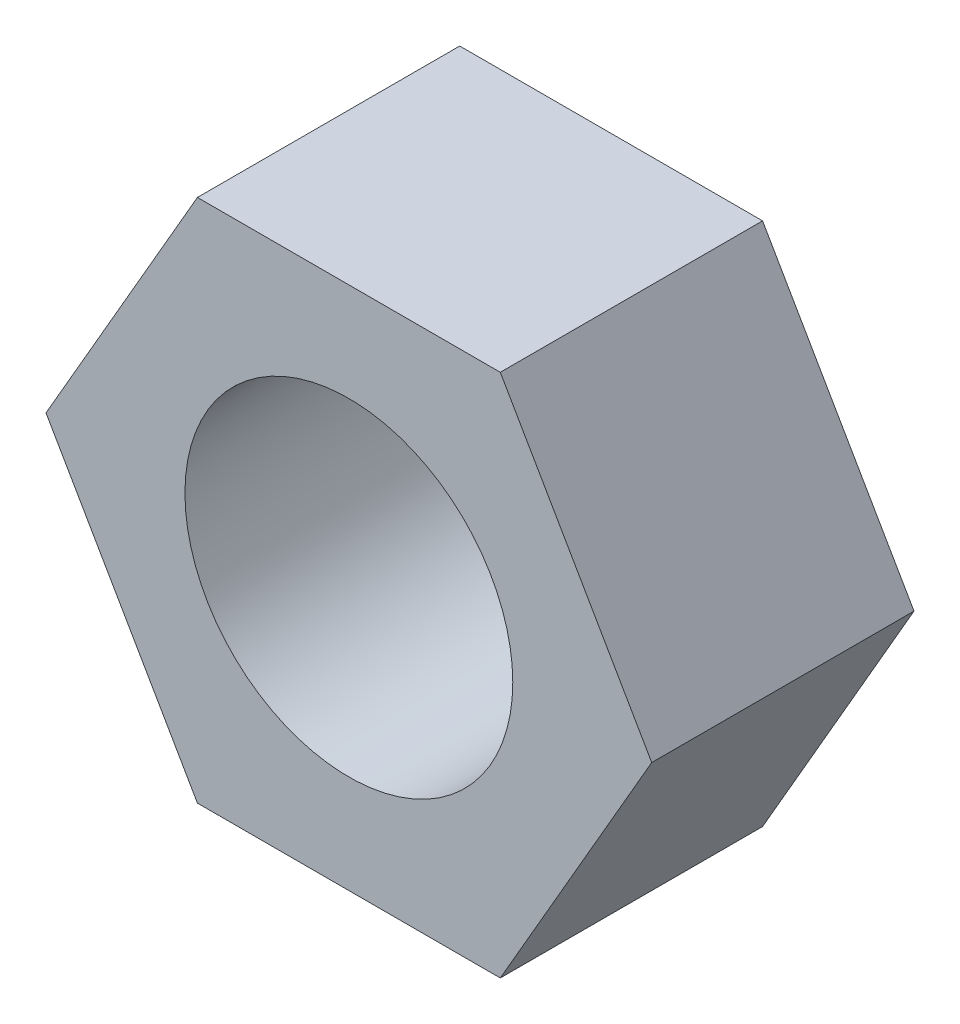
ISO-10303-21;
HEADER;
FILE_DESCRIPTION(('STEP AP214'),'2;1');
FILE_NAME('part.step','',(''),(''),'','','');
FILE_SCHEMA(('AUTOMOTIVE_DESIGN { 1 0 10303 214 1 1 1 1 }'));
ENDSEC;
DATA;
#1=APPLICATION_CONTEXT('core data for automotive mechanical design processes');
#2=APPLICATION_PROTOCOL_DEFINITION('international standard','automotive_design',2000,#1);
#3=PRODUCT_CONTEXT('',#1,'mechanical');
#4=PRODUCT('Part','Part','',(#3));
#5=PRODUCT_RELATED_PRODUCT_CATEGORY('part','',(#4));
#6=PRODUCT_DEFINITION_FORMATION('','',#4);
#7=PRODUCT_DEFINITION_CONTEXT('part definition',#1,'design');
#8=PRODUCT_DEFINITION('design','',#6,#7);
#9=PRODUCT_DEFINITION_SHAPE('','',#8);
#10=(LENGTH_UNIT() NAMED_UNIT(*) SI_UNIT(.MILLI.,.METRE.));
#11=(NAMED_UNIT(*) PLANE_ANGLE_UNIT() SI_UNIT($,.RADIAN.));
#12=(NAMED_UNIT(*) SI_UNIT($,.STERADIAN.) SOLID_ANGLE_UNIT());
#13=UNCERTAINTY_MEASURE_WITH_UNIT(LENGTH_MEASURE(1.E-05),#10,'distance_accuracy_value','');
#14=(GEOMETRIC_REPRESENTATION_CONTEXT(3) GLOBAL_UNCERTAINTY_ASSIGNED_CONTEXT((#13)) GLOBAL_UNIT_ASSIGNED_CONTEXT((#10,
#11,#12)) REPRESENTATION_CONTEXT('',''));
#15=CARTESIAN_POINT('',(0.,0.,0.));
#16=DIRECTION('',(0.,0.,1.));
#17=DIRECTION('',(1.,0.,0.));
#18=AXIS2_PLACEMENT_3D('',#15,#16,#17);
#19=CARTESIAN_POINT('',(0.,0.,4.));
#20=DIRECTION('',(0.,0.,1.));
#21=DIRECTION('',(1.,0.,0.));
#22=AXIS2_PLACEMENT_3D('',#19,#20,#21);
#23=PLANE('',#22);
#24=DIRECTION('',(0.5,0.866025403784439,0.));
#25=VECTOR('',#24,1.);
#26=CARTESIAN_POINT('',(2.3094010767585,-4.,4.));
#27=LINE('',#26,#25);
#28=CARTESIAN_POINT('',(2.3094010767585,-4.,4.));
#29=VERTEX_POINT('',#28);
#30=CARTESIAN_POINT('',(4.61880215351701,0.,4.));
#31=VERTEX_POINT('',#30);
#32=EDGE_CURVE('E140',#29,#31,#27,.T.);
#33=ORIENTED_EDGE('',*,*,#32,.T.);
#34=DIRECTION('',(-0.5,0.866025403784439,0.));
#35=VECTOR('',#34,1.);
#36=CARTESIAN_POINT('',(4.61880215351701,0.,4.));
#37=LINE('',#36,#35);
#38=CARTESIAN_POINT('',(2.3094010767585,4.,4.));
#39=VERTEX_POINT('',#38);
#40=EDGE_CURVE('E94',#31,#39,#37,.T.);
#41=ORIENTED_EDGE('',*,*,#40,.T.);
#42=DIRECTION('',(-1.,0.,0.));
#43=VECTOR('',#42,1.);
#44=CARTESIAN_POINT('',(2.3094010767585,4.,4.));
#45=LINE('',#44,#43);
#46=CARTESIAN_POINT('',(-2.3094010767585,4.,4.));
#47=VERTEX_POINT('',#46);
#48=EDGE_CURVE('E109',#39,#47,#45,.T.);
#49=ORIENTED_EDGE('',*,*,#48,.T.);
#50=DIRECTION('',(-0.5,-0.866025403784439,0.));
#51=VECTOR('',#50,1.);
#52=CARTESIAN_POINT('',(-2.3094010767585,4.,4.));
#53=LINE('',#52,#51);
#54=CARTESIAN_POINT('',(-4.61880215351701,0.,4.));
#55=VERTEX_POINT('',#54);
#56=EDGE_CURVE('E105',#47,#55,#53,.T.);
#57=ORIENTED_EDGE('',*,*,#56,.T.);
#58=DIRECTION('',(0.5,-0.866025403784439,0.));
#59=VECTOR('',#58,1.);
#60=CARTESIAN_POINT('',(-4.61880215351701,0.,4.));
#61=LINE('',#60,#59);
#62=CARTESIAN_POINT('',(-2.30940107675851,-4.,4.));
#63=VERTEX_POINT('',#62);
#64=EDGE_CURVE('E106',#55,#63,#61,.T.);
#65=ORIENTED_EDGE('',*,*,#64,.T.);
#66=DIRECTION('',(1.,0.,0.));
#67=VECTOR('',#66,1.);
#68=CARTESIAN_POINT('',(-2.30940107675851,-4.,4.));
#69=LINE('',#68,#67);
#70=EDGE_CURVE('E59',#63,#29,#69,.T.);
#71=ORIENTED_EDGE('',*,*,#70,.T.);
#72=EDGE_LOOP('',(#33,#41,#49,#57,#65,#71));
#73=FACE_BOUND('',#72,.T.);
#74=CARTESIAN_POINT('',(0.,0.,4.));
#75=DIRECTION('',(0.,0.,1.));
#76=DIRECTION('',(1.,0.,0.));
#77=AXIS2_PLACEMENT_3D('',#74,#75,#76);
#78=CIRCLE('',#77,2.5);
#79=CARTESIAN_POINT('',(2.5,0.,4.));
#80=VERTEX_POINT('',#79);
#81=EDGE_CURVE('E127',#80,#80,#78,.T.);
#82=ORIENTED_EDGE('',*,*,#81,.F.);
#83=EDGE_LOOP('',(#82));
#84=FACE_BOUND('',#83,.T.);
#85=ADVANCED_FACE('F41',(#73,#84),#23,.T.);
#86=CARTESIAN_POINT('',(0.,0.,0.));
#87=DIRECTION('',(0.,0.,1.));
#88=DIRECTION('',(1.,0.,0.));
#89=AXIS2_PLACEMENT_3D('',#86,#87,#88);
#90=PLANE('',#89);
#91=DIRECTION('',(0.5,0.866025403784439,0.));
#92=VECTOR('',#91,1.);
#93=CARTESIAN_POINT('',(2.3094010767585,-4.,0.));
#94=LINE('',#93,#92);
#95=CARTESIAN_POINT('',(2.3094010767585,-4.,0.));
#96=VERTEX_POINT('',#95);
#97=CARTESIAN_POINT('',(4.61880215351701,0.,0.));
#98=VERTEX_POINT('',#97);
#99=EDGE_CURVE('E128',#96,#98,#94,.T.);
#100=ORIENTED_EDGE('',*,*,#99,.F.);
#101=DIRECTION('',(1.,0.,0.));
#102=VECTOR('',#101,1.);
#103=CARTESIAN_POINT('',(-2.30940107675851,-4.,0.));
#104=LINE('',#103,#102);
#105=CARTESIAN_POINT('',(-2.30940107675851,-4.,0.));
#106=VERTEX_POINT('',#105);
#107=EDGE_CURVE('E90',#106,#96,#104,.T.);
#108=ORIENTED_EDGE('',*,*,#107,.F.);
#109=DIRECTION('',(0.5,-0.866025403784439,0.));
#110=VECTOR('',#109,1.);
#111=CARTESIAN_POINT('',(-4.61880215351701,0.,0.));
#112=LINE('',#111,#110);
#113=CARTESIAN_POINT('',(-4.61880215351701,0.,0.));
#114=VERTEX_POINT('',#113);
#115=EDGE_CURVE('E83',#114,#106,#112,.T.);
#116=ORIENTED_EDGE('',*,*,#115,.F.);
#117=DIRECTION('',(-0.5,-0.866025403784439,0.));
#118=VECTOR('',#117,1.);
#119=CARTESIAN_POINT('',(-2.3094010767585,4.,0.));
#120=LINE('',#119,#118);
#121=CARTESIAN_POINT('',(-2.3094010767585,4.,0.));
#122=VERTEX_POINT('',#121);
#123=EDGE_CURVE('E116',#122,#114,#120,.T.);
#124=ORIENTED_EDGE('',*,*,#123,.F.);
#125=DIRECTION('',(-1.,0.,0.));
#126=VECTOR('',#125,1.);
#127=CARTESIAN_POINT('',(2.3094010767585,4.,0.));
#128=LINE('',#127,#126);
#129=CARTESIAN_POINT('',(2.3094010767585,4.,0.));
#130=VERTEX_POINT('',#129);
#131=EDGE_CURVE('E135',#130,#122,#128,.T.);
#132=ORIENTED_EDGE('',*,*,#131,.F.);
#133=DIRECTION('',(-0.5,0.866025403784439,0.));
#134=VECTOR('',#133,1.);
#135=CARTESIAN_POINT('',(4.61880215351701,0.,0.));
#136=LINE('',#135,#134);
#137=EDGE_CURVE('E129',#98,#130,#136,.T.);
#138=ORIENTED_EDGE('',*,*,#137,.F.);
#139=EDGE_LOOP('',(#100,#108,#116,#124,#132,#138));
#140=FACE_BOUND('',#139,.T.);
#141=CARTESIAN_POINT('',(0.,0.,0.));
#142=DIRECTION('',(0.,0.,1.));
#143=DIRECTION('',(1.,0.,0.));
#144=AXIS2_PLACEMENT_3D('',#141,#142,#143);
#145=CIRCLE('',#144,2.5);
#146=CARTESIAN_POINT('',(2.5,0.,0.));
#147=VERTEX_POINT('',#146);
#148=EDGE_CURVE('E229',#147,#147,#145,.T.);
#149=ORIENTED_EDGE('',*,*,#148,.T.);
#150=EDGE_LOOP('',(#149));
#151=FACE_BOUND('',#150,.T.);
#152=ADVANCED_FACE('F147',(#140,#151),#90,.F.);
#153=CARTESIAN_POINT('',(2.3094010767585,-4.,4.));
#154=DIRECTION('',(-0.866025403784439,0.5,0.));
#155=DIRECTION('',(-0.5,-0.866025403784439,0.));
#156=AXIS2_PLACEMENT_3D('',#153,#154,#155);
#157=PLANE('',#156);
#158=ORIENTED_EDGE('',*,*,#99,.T.);
#159=DIRECTION('',(0.,0.,-1.));
#160=VECTOR('',#159,1.);
#161=CARTESIAN_POINT('',(4.61880215351701,0.,4.));
#162=LINE('',#161,#160);
#163=EDGE_CURVE('E11',#31,#98,#162,.T.);
#164=ORIENTED_EDGE('',*,*,#163,.F.);
#165=ORIENTED_EDGE('',*,*,#32,.F.);
#166=DIRECTION('',(0.,0.,-1.));
#167=VECTOR('',#166,1.);
#168=CARTESIAN_POINT('',(2.3094010767585,-4.,4.));
#169=LINE('',#168,#167);
#170=EDGE_CURVE('E122',#29,#96,#169,.T.);
#171=ORIENTED_EDGE('',*,*,#170,.T.);
#172=EDGE_LOOP('',(#158,#164,#165,#171));
#173=FACE_BOUND('',#172,.T.);
#174=ADVANCED_FACE('F43',(#173),#157,.F.);
#175=CARTESIAN_POINT('',(4.61880215351701,0.,4.));
#176=DIRECTION('',(-0.866025403784439,-0.5,0.));
#177=DIRECTION('',(0.5,-0.866025403784439,0.));
#178=AXIS2_PLACEMENT_3D('',#175,#176,#177);
#179=PLANE('',#178);
#180=ORIENTED_EDGE('',*,*,#137,.T.);
#181=DIRECTION('',(0.,0.,-1.));
#182=VECTOR('',#181,1.);
#183=CARTESIAN_POINT('',(2.3094010767585,4.,4.));
#184=LINE('',#183,#182);
#185=EDGE_CURVE('E49',#39,#130,#184,.T.);
#186=ORIENTED_EDGE('',*,*,#185,.F.);
#187=ORIENTED_EDGE('',*,*,#40,.F.);
#188=ORIENTED_EDGE('',*,*,#163,.T.);
#189=EDGE_LOOP('',(#180,#186,#187,#188));
#190=FACE_BOUND('',#189,.T.);
#191=ADVANCED_FACE('F173',(#190),#179,.F.);
#192=CARTESIAN_POINT('',(2.3094010767585,4.,4.));
#193=DIRECTION('',(0.,-1.,0.));
#194=DIRECTION('',(1.,0.,0.));
#195=AXIS2_PLACEMENT_3D('',#192,#193,#194);
#196=PLANE('',#195);
#197=ORIENTED_EDGE('',*,*,#131,.T.);
#198=DIRECTION('',(0.,0.,-1.));
#199=VECTOR('',#198,1.);
#200=CARTESIAN_POINT('',(-2.3094010767585,4.,4.));
#201=LINE('',#200,#199);
#202=EDGE_CURVE('E117',#47,#122,#201,.T.);
#203=ORIENTED_EDGE('',*,*,#202,.F.);
#204=ORIENTED_EDGE('',*,*,#48,.F.);
#205=ORIENTED_EDGE('',*,*,#185,.T.);
#206=EDGE_LOOP('',(#197,#203,#204,#205));
#207=FACE_BOUND('',#206,.T.);
#208=ADVANCED_FACE('F142',(#207),#196,.F.);
#209=CARTESIAN_POINT('',(-2.3094010767585,4.,4.));
#210=DIRECTION('',(0.866025403784439,-0.5,0.));
#211=DIRECTION('',(0.5,0.866025403784439,0.));
#212=AXIS2_PLACEMENT_3D('',#209,#210,#211);
#213=PLANE('',#212);
#214=ORIENTED_EDGE('',*,*,#123,.T.);
#215=DIRECTION('',(0.,0.,-1.));
#216=VECTOR('',#215,1.);
#217=CARTESIAN_POINT('',(-4.61880215351701,0.,4.));
#218=LINE('',#217,#216);
#219=EDGE_CURVE('E111',#55,#114,#218,.T.);
#220=ORIENTED_EDGE('',*,*,#219,.F.);
#221=ORIENTED_EDGE('',*,*,#56,.F.);
#222=ORIENTED_EDGE('',*,*,#202,.T.);
#223=EDGE_LOOP('',(#214,#220,#221,#222));
#224=FACE_BOUND('',#223,.T.);
#225=ADVANCED_FACE('F114',(#224),#213,.F.);
#226=CARTESIAN_POINT('',(-4.61880215351701,0.,4.));
#227=DIRECTION('',(0.866025403784439,0.499999999999999,0.));
#228=DIRECTION('',(-0.5,0.866025403784439,0.));
#229=AXIS2_PLACEMENT_3D('',#226,#227,#228);
#230=PLANE('',#229);
#231=ORIENTED_EDGE('',*,*,#115,.T.);
#232=DIRECTION('',(0.,0.,-1.));
#233=VECTOR('',#232,1.);
#234=CARTESIAN_POINT('',(-2.30940107675851,-4.,4.));
#235=LINE('',#234,#233);
#236=EDGE_CURVE('E119',#63,#106,#235,.T.);
#237=ORIENTED_EDGE('',*,*,#236,.F.);
#238=ORIENTED_EDGE('',*,*,#64,.F.);
#239=ORIENTED_EDGE('',*,*,#219,.T.);
#240=EDGE_LOOP('',(#231,#237,#238,#239));
#241=FACE_BOUND('',#240,.T.);
#242=ADVANCED_FACE('F120',(#241),#230,.F.);
#243=CARTESIAN_POINT('',(-2.30940107675851,-4.,4.));
#244=DIRECTION('',(0.,1.,0.));
#245=DIRECTION('',(0.,0.,1.));
#246=AXIS2_PLACEMENT_3D('',#243,#244,#245);
#247=PLANE('',#246);
#248=ORIENTED_EDGE('',*,*,#107,.T.);
#249=ORIENTED_EDGE('',*,*,#170,.F.);
#250=ORIENTED_EDGE('',*,*,#70,.F.);
#251=ORIENTED_EDGE('',*,*,#236,.T.);
#252=EDGE_LOOP('',(#248,#249,#250,#251));
#253=FACE_BOUND('',#252,.T.);
#254=ADVANCED_FACE('F151',(#253),#247,.F.);
#255=CARTESIAN_POINT('',(0.,0.,4.));
#256=DIRECTION('',(0.,0.,-1.));
#257=DIRECTION('',(-1.,0.,0.));
#258=AXIS2_PLACEMENT_3D('',#255,#256,#257);
#259=CYLINDRICAL_SURFACE('',#258,2.5);
#260=ORIENTED_EDGE('',*,*,#81,.T.);
#261=EDGE_LOOP('',(#260));
#262=FACE_BOUND('',#261,.T.);
#263=ORIENTED_EDGE('',*,*,#148,.F.);
#264=EDGE_LOOP('',(#263));
#265=FACE_BOUND('',#264,.T.);
#266=ADVANCED_FACE('F154',(#262,#265),#259,.F.);
#267=CLOSED_SHELL('',(#85,#152,#174,#191,#208,#225,#242,#254,#266));
#268=MANIFOLD_SOLID_BREP('B2',#267);
#269=ADVANCED_BREP_SHAPE_REPRESENTATION('',(#18,#268),#14);
#270=SHAPE_DEFINITION_REPRESENTATION(#9,#269);
ENDSEC;
END-ISO-10303-21;
